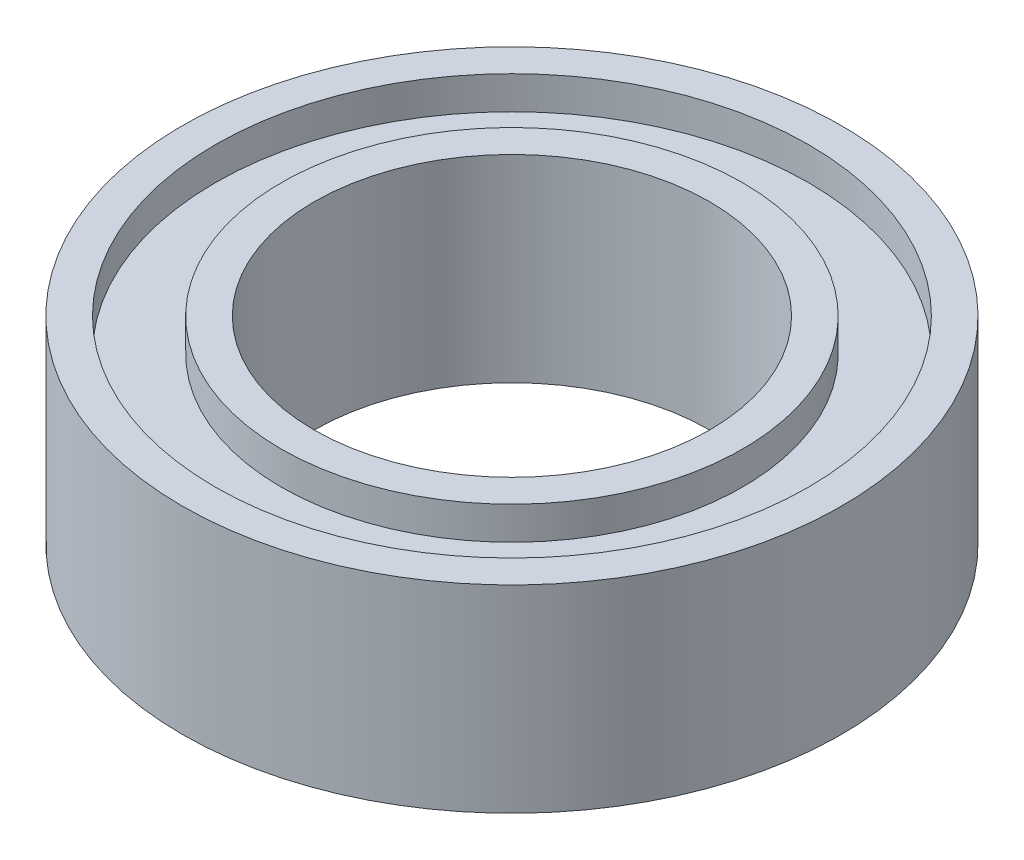
ISO-10303-21;
HEADER;
FILE_DESCRIPTION(('STEP AP214'),'2;1');
FILE_NAME('part.step','',(''),(''),'','','');
FILE_SCHEMA(('AUTOMOTIVE_DESIGN { 1 0 10303 214 1 1 1 1 }'));
ENDSEC;
DATA;
#1=APPLICATION_CONTEXT('core data for automotive mechanical design processes');
#2=APPLICATION_PROTOCOL_DEFINITION('international standard','automotive_design',2000,#1);
#3=PRODUCT_CONTEXT('',#1,'mechanical');
#4=PRODUCT('Part','Part','',(#3));
#5=PRODUCT_RELATED_PRODUCT_CATEGORY('part','',(#4));
#6=PRODUCT_DEFINITION_FORMATION('','',#4);
#7=PRODUCT_DEFINITION_CONTEXT('part definition',#1,'design');
#8=PRODUCT_DEFINITION('design','',#6,#7);
#9=PRODUCT_DEFINITION_SHAPE('','',#8);
#10=(LENGTH_UNIT() NAMED_UNIT(*) SI_UNIT(.MILLI.,.METRE.));
#11=(NAMED_UNIT(*) PLANE_ANGLE_UNIT() SI_UNIT($,.RADIAN.));
#12=(NAMED_UNIT(*) SI_UNIT($,.STERADIAN.) SOLID_ANGLE_UNIT());
#13=UNCERTAINTY_MEASURE_WITH_UNIT(LENGTH_MEASURE(1.E-05),#10,'distance_accuracy_value','');
#14=(GEOMETRIC_REPRESENTATION_CONTEXT(3) GLOBAL_UNCERTAINTY_ASSIGNED_CONTEXT((#13)) GLOBAL_UNIT_ASSIGNED_CONTEXT((#10,
#11,#12)) REPRESENTATION_CONTEXT('',''));
#15=CARTESIAN_POINT('',(0.,0.,0.));
#16=DIRECTION('',(0.,0.,1.));
#17=DIRECTION('',(1.,0.,0.));
#18=AXIS2_PLACEMENT_3D('',#15,#16,#17);
#19=CARTESIAN_POINT('',(0.,-1.5,0.));
#20=DIRECTION('',(0.,1.,0.));
#21=DIRECTION('',(0.,0.,1.));
#22=AXIS2_PLACEMENT_3D('',#19,#20,#21);
#23=PLANE('',#22);
#24=CARTESIAN_POINT('',(0.,-1.5,0.));
#25=DIRECTION('',(0.,1.,0.));
#26=DIRECTION('',(0.,0.,1.));
#27=AXIS2_PLACEMENT_3D('',#24,#25,#26);
#28=CIRCLE('',#27,3.);
#29=CARTESIAN_POINT('',(0.,-1.5,3.));
#30=VERTEX_POINT('',#29);
#31=EDGE_CURVE('E51',#30,#30,#28,.T.);
#32=ORIENTED_EDGE('',*,*,#31,.T.);
#33=EDGE_LOOP('',(#32));
#34=FACE_BOUND('',#33,.T.);
#35=CARTESIAN_POINT('',(0.,-1.5,0.));
#36=DIRECTION('',(0.,1.,0.));
#37=DIRECTION('',(0.,0.,1.));
#38=AXIS2_PLACEMENT_3D('',#35,#36,#37);
#39=CIRCLE('',#38,3.5);
#40=CARTESIAN_POINT('',(0.,-1.5,3.5));
#41=VERTEX_POINT('',#40);
#42=EDGE_CURVE('E83',#41,#41,#39,.T.);
#43=ORIENTED_EDGE('',*,*,#42,.F.);
#44=EDGE_LOOP('',(#43));
#45=FACE_BOUND('',#44,.T.);
#46=ADVANCED_FACE('F36',(#34,#45),#23,.F.);
#47=CARTESIAN_POINT('',(0.,1.5,0.));
#48=DIRECTION('',(0.,1.,0.));
#49=DIRECTION('',(0.,0.,1.));
#50=AXIS2_PLACEMENT_3D('',#47,#48,#49);
#51=PLANE('',#50);
#52=CARTESIAN_POINT('',(0.,1.5,0.));
#53=DIRECTION('',(0.,1.,0.));
#54=DIRECTION('',(0.,0.,1.));
#55=AXIS2_PLACEMENT_3D('',#52,#53,#54);
#56=CIRCLE('',#55,3.);
#57=CARTESIAN_POINT('',(0.,1.5,3.));
#58=VERTEX_POINT('',#57);
#59=EDGE_CURVE('E49',#58,#58,#56,.T.);
#60=ORIENTED_EDGE('',*,*,#59,.F.);
#61=EDGE_LOOP('',(#60));
#62=FACE_BOUND('',#61,.T.);
#63=CARTESIAN_POINT('',(0.,1.5,0.));
#64=DIRECTION('',(0.,1.,0.));
#65=DIRECTION('',(0.,0.,1.));
#66=AXIS2_PLACEMENT_3D('',#63,#64,#65);
#67=CIRCLE('',#66,3.5);
#68=CARTESIAN_POINT('',(0.,1.5,3.5));
#69=VERTEX_POINT('',#68);
#70=EDGE_CURVE('E67',#69,#69,#67,.T.);
#71=ORIENTED_EDGE('',*,*,#70,.T.);
#72=EDGE_LOOP('',(#71));
#73=FACE_BOUND('',#72,.T.);
#74=ADVANCED_FACE('F101',(#62,#73),#51,.T.);
#75=CARTESIAN_POINT('',(0.,1.5,0.));
#76=DIRECTION('',(0.,1.,0.));
#77=DIRECTION('',(0.,0.,1.));
#78=AXIS2_PLACEMENT_3D('',#75,#76,#77);
#79=CIRCLE('',#78,4.5);
#80=CARTESIAN_POINT('',(0.,1.5,4.5));
#81=VERTEX_POINT('',#80);
#82=EDGE_CURVE('E59',#81,#81,#79,.T.);
#83=ORIENTED_EDGE('',*,*,#82,.F.);
#84=EDGE_LOOP('',(#83));
#85=FACE_BOUND('',#84,.T.);
#86=CARTESIAN_POINT('',(0.,1.5,0.));
#87=DIRECTION('',(0.,1.,0.));
#88=DIRECTION('',(0.,0.,1.));
#89=AXIS2_PLACEMENT_3D('',#86,#87,#88);
#90=CIRCLE('',#89,5.);
#91=CARTESIAN_POINT('',(0.,1.5,5.));
#92=VERTEX_POINT('',#91);
#93=EDGE_CURVE('E10',#92,#92,#90,.T.);
#94=ORIENTED_EDGE('',*,*,#93,.T.);
#95=EDGE_LOOP('',(#94));
#96=FACE_BOUND('',#95,.T.);
#97=ADVANCED_FACE('F107',(#85,#96),#51,.T.);
#98=CARTESIAN_POINT('',(0.,-1.5,0.));
#99=DIRECTION('',(0.,1.,0.));
#100=DIRECTION('',(0.,0.,1.));
#101=AXIS2_PLACEMENT_3D('',#98,#99,#100);
#102=CIRCLE('',#101,4.5);
#103=CARTESIAN_POINT('',(0.,-1.5,4.5));
#104=VERTEX_POINT('',#103);
#105=EDGE_CURVE('E75',#104,#104,#102,.T.);
#106=ORIENTED_EDGE('',*,*,#105,.T.);
#107=EDGE_LOOP('',(#106));
#108=FACE_BOUND('',#107,.T.);
#109=CARTESIAN_POINT('',(0.,-1.5,0.));
#110=DIRECTION('',(0.,1.,0.));
#111=DIRECTION('',(0.,0.,1.));
#112=AXIS2_PLACEMENT_3D('',#109,#110,#111);
#113=CIRCLE('',#112,5.);
#114=CARTESIAN_POINT('',(0.,-1.5,5.));
#115=VERTEX_POINT('',#114);
#116=EDGE_CURVE('E40',#115,#115,#113,.T.);
#117=ORIENTED_EDGE('',*,*,#116,.F.);
#118=EDGE_LOOP('',(#117));
#119=FACE_BOUND('',#118,.T.);
#120=ADVANCED_FACE('F103',(#108,#119),#23,.F.);
#121=CARTESIAN_POINT('',(0.,1.5,0.));
#122=DIRECTION('',(0.,-1.,0.));
#123=DIRECTION('',(0.,0.,-1.));
#124=AXIS2_PLACEMENT_3D('',#121,#122,#123);
#125=CYLINDRICAL_SURFACE('',#124,5.);
#126=ORIENTED_EDGE('',*,*,#93,.F.);
#127=EDGE_LOOP('',(#126));
#128=FACE_BOUND('',#127,.T.);
#129=ORIENTED_EDGE('',*,*,#116,.T.);
#130=EDGE_LOOP('',(#129));
#131=FACE_BOUND('',#130,.T.);
#132=ADVANCED_FACE('F38',(#128,#131),#125,.T.);
#133=CARTESIAN_POINT('',(0.,1.5,0.));
#134=DIRECTION('',(0.,-1.,0.));
#135=DIRECTION('',(0.,0.,-1.));
#136=AXIS2_PLACEMENT_3D('',#133,#134,#135);
#137=CYLINDRICAL_SURFACE('',#136,3.);
#138=ORIENTED_EDGE('',*,*,#59,.T.);
#139=EDGE_LOOP('',(#138));
#140=FACE_BOUND('',#139,.T.);
#141=ORIENTED_EDGE('',*,*,#31,.F.);
#142=EDGE_LOOP('',(#141));
#143=FACE_BOUND('',#142,.T.);
#144=ADVANCED_FACE('F116',(#140,#143),#137,.F.);
#145=CARTESIAN_POINT('',(0.,1.,0.));
#146=DIRECTION('',(0.,1.,0.));
#147=DIRECTION('',(0.,0.,1.));
#148=AXIS2_PLACEMENT_3D('',#145,#146,#147);
#149=CYLINDRICAL_SURFACE('',#148,4.5);
#150=CARTESIAN_POINT('',(0.,1.,0.));
#151=DIRECTION('',(0.,1.,0.));
#152=DIRECTION('',(0.,0.,1.));
#153=AXIS2_PLACEMENT_3D('',#150,#151,#152);
#154=CIRCLE('',#153,4.5);
#155=CARTESIAN_POINT('',(0.,1.,4.5));
#156=VERTEX_POINT('',#155);
#157=EDGE_CURVE('E55',#156,#156,#154,.T.);
#158=ORIENTED_EDGE('',*,*,#157,.F.);
#159=EDGE_LOOP('',(#158));
#160=FACE_BOUND('',#159,.T.);
#161=ORIENTED_EDGE('',*,*,#82,.T.);
#162=EDGE_LOOP('',(#161));
#163=FACE_BOUND('',#162,.T.);
#164=ADVANCED_FACE('F140',(#160,#163),#149,.F.);
#165=CARTESIAN_POINT('',(0.,1.,0.));
#166=DIRECTION('',(0.,1.,0.));
#167=DIRECTION('',(0.,0.,1.));
#168=AXIS2_PLACEMENT_3D('',#165,#166,#167);
#169=PLANE('',#168);
#170=CARTESIAN_POINT('',(0.,1.,0.));
#171=DIRECTION('',(0.,1.,0.));
#172=DIRECTION('',(0.,0.,1.));
#173=AXIS2_PLACEMENT_3D('',#170,#171,#172);
#174=CIRCLE('',#173,3.5);
#175=CARTESIAN_POINT('',(0.,1.,3.5));
#176=VERTEX_POINT('',#175);
#177=EDGE_CURVE('E63',#176,#176,#174,.T.);
#178=ORIENTED_EDGE('',*,*,#177,.F.);
#179=EDGE_LOOP('',(#178));
#180=FACE_BOUND('',#179,.T.);
#181=ORIENTED_EDGE('',*,*,#157,.T.);
#182=EDGE_LOOP('',(#181));
#183=FACE_BOUND('',#182,.T.);
#184=ADVANCED_FACE('F136',(#180,#183),#169,.T.);
#185=CARTESIAN_POINT('',(0.,1.,0.));
#186=DIRECTION('',(0.,1.,0.));
#187=DIRECTION('',(0.,0.,1.));
#188=AXIS2_PLACEMENT_3D('',#185,#186,#187);
#189=CYLINDRICAL_SURFACE('',#188,3.5);
#190=ORIENTED_EDGE('',*,*,#177,.T.);
#191=EDGE_LOOP('',(#190));
#192=FACE_BOUND('',#191,.T.);
#193=ORIENTED_EDGE('',*,*,#70,.F.);
#194=EDGE_LOOP('',(#193));
#195=FACE_BOUND('',#194,.T.);
#196=ADVANCED_FACE('F130',(#192,#195),#189,.T.);
#197=CARTESIAN_POINT('',(0.,-1.,0.));
#198=DIRECTION('',(0.,-1.,0.));
#199=DIRECTION('',(0.,0.,1.));
#200=AXIS2_PLACEMENT_3D('',#197,#198,#199);
#201=PLANE('',#200);
#202=CARTESIAN_POINT('',(0.,-1.,0.));
#203=DIRECTION('',(0.,1.,0.));
#204=DIRECTION('',(0.,0.,1.));
#205=AXIS2_PLACEMENT_3D('',#202,#203,#204);
#206=CIRCLE('',#205,4.5);
#207=CARTESIAN_POINT('',(0.,-1.,4.5));
#208=VERTEX_POINT('',#207);
#209=EDGE_CURVE('E71',#208,#208,#206,.T.);
#210=ORIENTED_EDGE('',*,*,#209,.F.);
#211=EDGE_LOOP('',(#210));
#212=FACE_BOUND('',#211,.T.);
#213=CARTESIAN_POINT('',(0.,-1.,0.));
#214=DIRECTION('',(0.,1.,0.));
#215=DIRECTION('',(0.,0.,1.));
#216=AXIS2_PLACEMENT_3D('',#213,#214,#215);
#217=CIRCLE('',#216,3.5);
#218=CARTESIAN_POINT('',(0.,-1.,3.5));
#219=VERTEX_POINT('',#218);
#220=EDGE_CURVE('E79',#219,#219,#217,.T.);
#221=ORIENTED_EDGE('',*,*,#220,.T.);
#222=EDGE_LOOP('',(#221));
#223=FACE_BOUND('',#222,.T.);
#224=ADVANCED_FACE('F91',(#212,#223),#201,.T.);
#225=CARTESIAN_POINT('',(0.,-1.,0.));
#226=DIRECTION('',(0.,-1.,0.));
#227=DIRECTION('',(0.,0.,-1.));
#228=AXIS2_PLACEMENT_3D('',#225,#226,#227);
#229=CYLINDRICAL_SURFACE('',#228,4.5);
#230=ORIENTED_EDGE('',*,*,#209,.T.);
#231=EDGE_LOOP('',(#230));
#232=FACE_BOUND('',#231,.T.);
#233=ORIENTED_EDGE('',*,*,#105,.F.);
#234=EDGE_LOOP('',(#233));
#235=FACE_BOUND('',#234,.T.);
#236=ADVANCED_FACE('F96',(#232,#235),#229,.F.);
#237=CARTESIAN_POINT('',(0.,-1.,0.));
#238=DIRECTION('',(0.,-1.,0.));
#239=DIRECTION('',(0.,0.,-1.));
#240=AXIS2_PLACEMENT_3D('',#237,#238,#239);
#241=CYLINDRICAL_SURFACE('',#240,3.5);
#242=ORIENTED_EDGE('',*,*,#220,.F.);
#243=EDGE_LOOP('',(#242));
#244=FACE_BOUND('',#243,.T.);
#245=ORIENTED_EDGE('',*,*,#42,.T.);
#246=EDGE_LOOP('',(#245));
#247=FACE_BOUND('',#246,.T.);
#248=ADVANCED_FACE('F93',(#244,#247),#241,.T.);
#249=CLOSED_SHELL('',(#46,#74,#97,#120,#132,#144,#164,#184,#196,#224,#236,#248));
#250=MANIFOLD_SOLID_BREP('B2',#249);
#251=ADVANCED_BREP_SHAPE_REPRESENTATION('',(#18,#250),#14);
#252=SHAPE_DEFINITION_REPRESENTATION(#9,#251);
ENDSEC;
END-ISO-10303-21;
